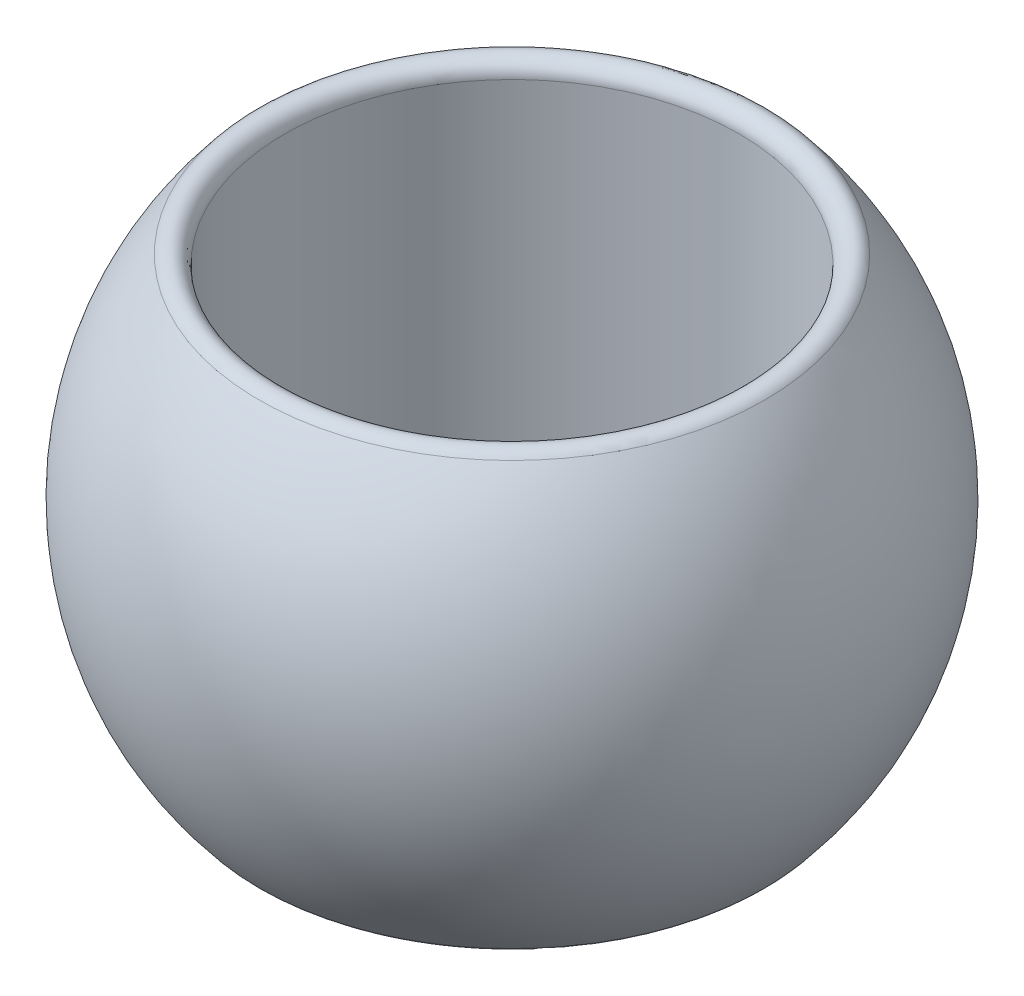
ISO-10303-21;
HEADER;
FILE_DESCRIPTION(('STEP AP214'),'2;1');
FILE_NAME('part.step','',(''),(''),'','','');
FILE_SCHEMA(('AUTOMOTIVE_DESIGN { 1 0 10303 214 1 1 1 1 }'));
ENDSEC;
DATA;
#1=APPLICATION_CONTEXT('core data for automotive mechanical design processes');
#2=APPLICATION_PROTOCOL_DEFINITION('international standard','automotive_design',2000,#1);
#3=PRODUCT_CONTEXT('',#1,'mechanical');
#4=PRODUCT('Part','Part','',(#3));
#5=PRODUCT_RELATED_PRODUCT_CATEGORY('part','',(#4));
#6=PRODUCT_DEFINITION_FORMATION('','',#4);
#7=PRODUCT_DEFINITION_CONTEXT('part definition',#1,'design');
#8=PRODUCT_DEFINITION('design','',#6,#7);
#9=PRODUCT_DEFINITION_SHAPE('','',#8);
#10=(LENGTH_UNIT() NAMED_UNIT(*) SI_UNIT(.MILLI.,.METRE.));
#11=(NAMED_UNIT(*) PLANE_ANGLE_UNIT() SI_UNIT($,.RADIAN.));
#12=(NAMED_UNIT(*) SI_UNIT($,.STERADIAN.) SOLID_ANGLE_UNIT());
#13=UNCERTAINTY_MEASURE_WITH_UNIT(LENGTH_MEASURE(1.E-05),#10,'distance_accuracy_value','');
#14=(GEOMETRIC_REPRESENTATION_CONTEXT(3) GLOBAL_UNCERTAINTY_ASSIGNED_CONTEXT((#13)) GLOBAL_UNIT_ASSIGNED_CONTEXT((#10,
#11,#12)) REPRESENTATION_CONTEXT('',''));
#15=CARTESIAN_POINT('',(0.,0.,0.));
#16=DIRECTION('',(0.,0.,1.));
#17=DIRECTION('',(1.,0.,0.));
#18=AXIS2_PLACEMENT_3D('',#15,#16,#17);
#19=CARTESIAN_POINT('',(0.,0.,0.));
#20=DIRECTION('',(0.,1.,0.));
#21=DIRECTION('',(1.,0.,0.));
#22=AXIS2_PLACEMENT_3D('',#19,#20,#21);
#23=SPHERICAL_SURFACE('',#22,4.5);
#24=CARTESIAN_POINT('',(0.,2.88503345973981,0.));
#25=DIRECTION('',(0.,-1.,0.));
#26=DIRECTION('',(0.,0.,-1.));
#27=AXIS2_PLACEMENT_3D('',#24,#25,#26);
#28=CIRCLE('',#27,3.45348837209302);
#29=CARTESIAN_POINT('',(3.45348837209302,2.88503345973981,0.));
#30=VERTEX_POINT('',#29);
#31=EDGE_CURVE('E10',#30,#30,#28,.T.);
#32=CARTESIAN_POINT('',(0.,-2.88503345973981,0.));
#33=DIRECTION('',(0.,1.,0.));
#34=DIRECTION('',(0.,0.,1.));
#35=AXIS2_PLACEMENT_3D('',#32,#33,#34);
#36=CIRCLE('',#35,3.45348837209302);
#37=CARTESIAN_POINT('',(3.45348837209302,-2.88503345973981,0.));
#38=VERTEX_POINT('',#37);
#39=EDGE_CURVE('E45',#38,#38,#36,.T.);
#40=CARTESIAN_POINT('',(3.45348837209302,2.88503345973981,0.));
#41=CARTESIAN_POINT('',(3.49531941059942,2.83496171098831,0.));
#42=CARTESIAN_POINT('',(3.53605994778057,2.7839790554362,0.));
#43=CARTESIAN_POINT('',(3.61528631425115,2.68029094526151,0.));
#44=CARTESIAN_POINT('',(3.65377214354059,2.62758549063892,0.));
#45=CARTESIAN_POINT('',(3.72841538898656,2.52055079685394,0.));
#46=CARTESIAN_POINT('',(3.76457280514309,2.46622155769155,0.));
#47=CARTESIAN_POINT('',(3.83449106662507,2.35604225433573,0.));
#48=CARTESIAN_POINT('',(3.8682519119505,2.30019219014229,0.));
#49=CARTESIAN_POINT('',(3.9333131014496,2.18707683919966,0.));
#50=CARTESIAN_POINT('',(3.96461344562326,2.12981155245047,0.));
#51=CARTESIAN_POINT('',(4.02469443909813,2.01397409875407,0.));
#52=CARTESIAN_POINT('',(4.05347508839935,1.95540193180685,0.));
#53=CARTESIAN_POINT('',(4.10846224294516,1.83706151550612,0.));
#54=CARTESIAN_POINT('',(4.13466874818976,1.7772932661526,0.));
#55=CARTESIAN_POINT('',(4.18445804085413,1.65667374996918,0.));
#56=CARTESIAN_POINT('',(4.2080408282739,1.59582248313927,0.));
#57=CARTESIAN_POINT('',(4.25253807324561,1.47315204447786,0.));
#58=CARTESIAN_POINT('',(4.27345253079755,1.41133287264636,0.));
#59=CARTESIAN_POINT('',(4.31257355211019,1.28684356777184,0.));
#60=CARTESIAN_POINT('',(4.3307801158709,1.22417343472881,0.));
#61=CARTESIAN_POINT('',(4.36445090810428,1.09810076090346,0.));
#62=CARTESIAN_POINT('',(4.37991513657697,1.03469822012113,0.));
#63=CARTESIAN_POINT('',(4.40807200446109,0.907280669812983,0.));
#64=CARTESIAN_POINT('',(4.42076464387251,0.843265660287165,0.));
#65=CARTESIAN_POINT('',(4.44335432288543,0.714744270092668,0.));
#66=CARTESIAN_POINT('',(4.45325136248692,0.65023788942399,0.));
#67=CARTESIAN_POINT('',(4.47023111958746,0.520855784075993,0.));
#68=CARTESIAN_POINT('',(4.47731383708652,0.455980059396675,0.));
#69=CARTESIAN_POINT('',(4.48865155156019,0.325981991849596,0.));
#70=CARTESIAN_POINT('',(4.49290654853481,0.260859648981834,0.));
#71=CARTESIAN_POINT('',(4.49858077275471,0.130491537409381,0.));
#72=CARTESIAN_POINT('',(4.5,0.0652457687046906,0.));
#73=CARTESIAN_POINT('',(4.5,-0.0652457687046906,0.));
#74=CARTESIAN_POINT('',(4.49858077275471,-0.130491537409381,0.));
#75=CARTESIAN_POINT('',(4.49290654853481,-0.260859648981834,0.));
#76=CARTESIAN_POINT('',(4.48865155156019,-0.325981991849595,0.));
#77=CARTESIAN_POINT('',(4.47731383708652,-0.455980059396675,0.));
#78=CARTESIAN_POINT('',(4.47023111958746,-0.520855784075993,0.));
#79=CARTESIAN_POINT('',(4.45325136248692,-0.65023788942399,0.));
#80=CARTESIAN_POINT('',(4.44335432288543,-0.714744270092668,0.));
#81=CARTESIAN_POINT('',(4.42076464387251,-0.843265660287165,0.));
#82=CARTESIAN_POINT('',(4.40807200446109,-0.907280669812983,0.));
#83=CARTESIAN_POINT('',(4.37991513657697,-1.03469822012113,0.));
#84=CARTESIAN_POINT('',(4.36445090810428,-1.09810076090346,0.));
#85=CARTESIAN_POINT('',(4.3307801158709,-1.22417343472881,0.));
#86=CARTESIAN_POINT('',(4.31257355211019,-1.28684356777184,0.));
#87=CARTESIAN_POINT('',(4.27345253079755,-1.41133287264636,0.));
#88=CARTESIAN_POINT('',(4.25253807324561,-1.47315204447786,0.));
#89=CARTESIAN_POINT('',(4.2080408282739,-1.59582248313927,0.));
#90=CARTESIAN_POINT('',(4.18445804085413,-1.65667374996918,0.));
#91=CARTESIAN_POINT('',(4.13466874818976,-1.7772932661526,0.));
#92=CARTESIAN_POINT('',(4.10846224294516,-1.83706151550612,0.));
#93=CARTESIAN_POINT('',(4.05347508839935,-1.95540193180685,0.));
#94=CARTESIAN_POINT('',(4.02469443909813,-2.01397409875407,0.));
#95=CARTESIAN_POINT('',(3.96461344562326,-2.12981155245047,0.));
#96=CARTESIAN_POINT('',(3.9333131014496,-2.18707683919966,0.));
#97=CARTESIAN_POINT('',(3.8682519119505,-2.30019219014229,0.));
#98=CARTESIAN_POINT('',(3.83449106662507,-2.35604225433573,0.));
#99=CARTESIAN_POINT('',(3.76457280514309,-2.46622155769155,0.));
#100=CARTESIAN_POINT('',(3.72841538898656,-2.52055079685394,0.));
#101=CARTESIAN_POINT('',(3.65377214354059,-2.62758549063892,0.));
#102=CARTESIAN_POINT('',(3.61528631425115,-2.68029094526151,0.));
#103=CARTESIAN_POINT('',(3.53605994778057,-2.7839790554362,0.));
#104=CARTESIAN_POINT('',(3.49531941059942,-2.83496171098831,0.));
#105=CARTESIAN_POINT('',(3.45348837209302,-2.88503345973981,0.));
#106=B_SPLINE_CURVE_WITH_KNOTS('',3,(#40,#41,#42,#43,#44,#45,#46,#47,#48,#49,#50,#51,#52,#53,
#54,#55,#56,#57,#58,#59,#60,#61,#62,#63,#64,#65,#66,#67,#68,#69,#70,#71,#72,#73,#74,#75,#76,#77,
#78,#79,#80,#81,#82,#83,#84,#85,#86,#87,#88,#89,#90,#91,#92,#93,#94,#95,#96,#97,#98,#99,#100,
#101,#102,#103,#104,#105),.UNSPECIFIED.,.F.,.F.,(4,2,2,2,2,2,2,2,2,2,2,2,2,2,2,2,2,2,2,2,2,2,2,
2,2,2,2,2,2,2,2,2,4),(0.,0.195721879709857,0.391443759419714,0.587165639129571,
0.782887518839429,0.978609398549285,1.17433127825914,1.370053157969,1.56577503767886,
1.76149691738871,1.95721879709857,2.15294067680843,2.34866255651829,2.54438443622814,
2.740106315938,2.93582819564786,3.13155007535771,3.32727195506757,3.52299383477743,
3.71871571448729,3.91443759419714,4.110159473907,4.30588135361686,4.50160323332671,
4.69732511303657,4.89304699274643,5.08876887245628,5.28449075216614,5.480212631876,
5.67593451158586,5.87165639129571,6.06737827100557,6.26310015071543),.UNSPECIFIED.);
#107=EDGE_CURVE('BSEAM37',#30,#38,#106,.T.);
#108=ORIENTED_EDGE('',*,*,#31,.T.);
#109=ORIENTED_EDGE('',*,*,#39,.T.);
#110=ORIENTED_EDGE('',*,*,#107,.T.);
#111=ORIENTED_EDGE('',*,*,#107,.F.);
#112=EDGE_LOOP('',(#108,#110,#109,#111));
#113=FACE_BOUND('',#112,.T.);
#114=ADVANCED_FACE('F37',(#113),#23,.T.);
#115=CARTESIAN_POINT('',(0.,10.,0.));
#116=DIRECTION('',(0.,-1.,0.));
#117=DIRECTION('',(0.,0.,-1.));
#118=AXIS2_PLACEMENT_3D('',#115,#116,#117);
#119=CYLINDRICAL_SURFACE('',#118,3.1);
#120=CARTESIAN_POINT('',(0.,2.75680975041804,0.));
#121=DIRECTION('',(0.,-1.,0.));
#122=DIRECTION('',(0.,0.,-1.));
#123=AXIS2_PLACEMENT_3D('',#120,#121,#122);
#124=CIRCLE('',#123,3.1);
#125=CARTESIAN_POINT('',(0.,2.75680975041804,-3.1));
#126=VERTEX_POINT('',#125);
#127=EDGE_CURVE('E50',#126,#126,#124,.F.);
#128=ORIENTED_EDGE('',*,*,#127,.T.);
#129=EDGE_LOOP('',(#128));
#130=FACE_BOUND('',#129,.T.);
#131=CARTESIAN_POINT('',(0.,-2.75680975041804,0.));
#132=DIRECTION('',(0.,1.,0.));
#133=DIRECTION('',(0.,0.,1.));
#134=AXIS2_PLACEMENT_3D('',#131,#132,#133);
#135=CIRCLE('',#134,3.1);
#136=CARTESIAN_POINT('',(0.,-2.75680975041804,3.1));
#137=VERTEX_POINT('',#136);
#138=EDGE_CURVE('E55',#137,#137,#135,.F.);
#139=ORIENTED_EDGE('',*,*,#138,.T.);
#140=EDGE_LOOP('',(#139));
#141=FACE_BOUND('',#140,.T.);
#142=ADVANCED_FACE('F62',(#130,#141),#119,.F.);
#143=CARTESIAN_POINT('',(0.,2.75680975041804,0.));
#144=DIRECTION('',(0.,-1.,0.));
#145=DIRECTION('',(0.,0.,-1.));
#146=AXIS2_PLACEMENT_3D('',#143,#144,#145);
#147=TOROIDAL_SURFACE('',#146,3.3,0.2);
#148=ORIENTED_EDGE('',*,*,#31,.F.);
#149=EDGE_LOOP('',(#148));
#150=FACE_BOUND('',#149,.T.);
#151=ORIENTED_EDGE('',*,*,#127,.F.);
#152=EDGE_LOOP('',(#151));
#153=FACE_BOUND('',#152,.T.);
#154=ADVANCED_FACE('F65',(#150,#153),#147,.T.);
#155=CARTESIAN_POINT('',(0.,-2.75680975041804,0.));
#156=DIRECTION('',(0.,1.,0.));
#157=DIRECTION('',(0.,0.,1.));
#158=AXIS2_PLACEMENT_3D('',#155,#156,#157);
#159=TOROIDAL_SURFACE('',#158,3.3,0.2);
#160=ORIENTED_EDGE('',*,*,#39,.F.);
#161=EDGE_LOOP('',(#160));
#162=FACE_BOUND('',#161,.T.);
#163=ORIENTED_EDGE('',*,*,#138,.F.);
#164=EDGE_LOOP('',(#163));
#165=FACE_BOUND('',#164,.T.);
#166=ADVANCED_FACE('F39',(#162,#165),#159,.T.);
#167=CLOSED_SHELL('',(#114,#142,#154,#166));
#168=MANIFOLD_SOLID_BREP('B2',#167);
#169=ADVANCED_BREP_SHAPE_REPRESENTATION('',(#18,#168),#14);
#170=SHAPE_DEFINITION_REPRESENTATION(#9,#169);
ENDSEC;
END-ISO-10303-21;
